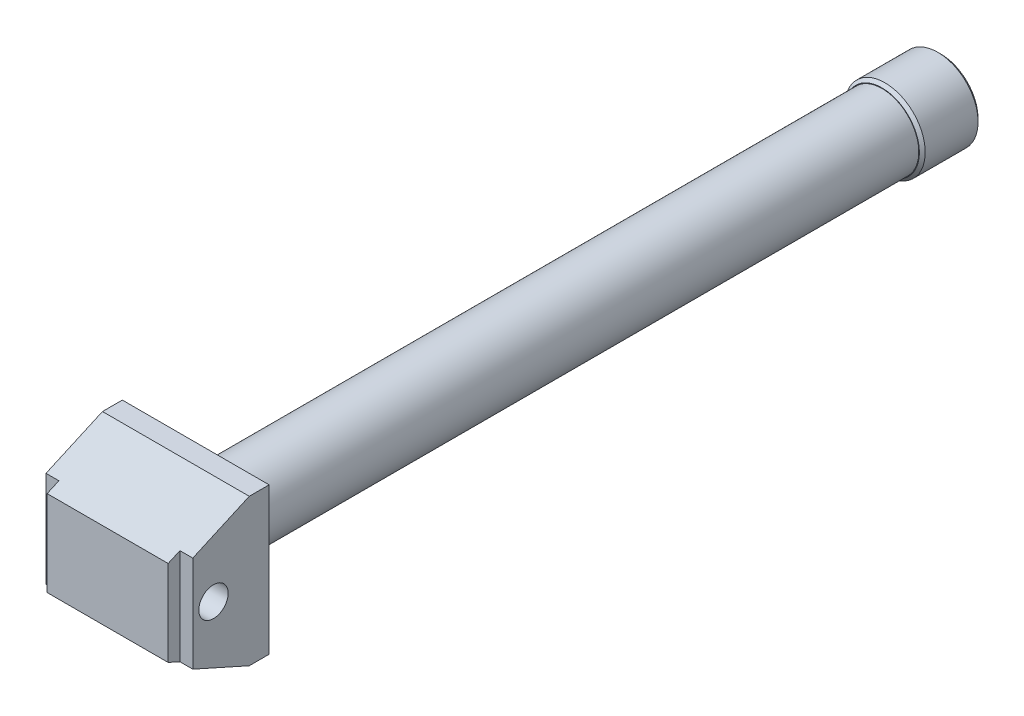
ISO-10303-21;
HEADER;
FILE_DESCRIPTION(('STEP AP214'),'2;1');
FILE_NAME('part.step','',(''),(''),'','','');
FILE_SCHEMA(('AUTOMOTIVE_DESIGN { 1 0 10303 214 1 1 1 1 }'));
ENDSEC;
DATA;
#1=APPLICATION_CONTEXT('core data for automotive mechanical design processes');
#2=APPLICATION_PROTOCOL_DEFINITION('international standard','automotive_design',2000,#1);
#3=PRODUCT_CONTEXT('',#1,'mechanical');
#4=PRODUCT('Part','Part','',(#3));
#5=PRODUCT_RELATED_PRODUCT_CATEGORY('part','',(#4));
#6=PRODUCT_DEFINITION_FORMATION('','',#4);
#7=PRODUCT_DEFINITION_CONTEXT('part definition',#1,'design');
#8=PRODUCT_DEFINITION('design','',#6,#7);
#9=PRODUCT_DEFINITION_SHAPE('','',#8);
#10=(LENGTH_UNIT() NAMED_UNIT(*) SI_UNIT(.MILLI.,.METRE.));
#11=(NAMED_UNIT(*) PLANE_ANGLE_UNIT() SI_UNIT($,.RADIAN.));
#12=(NAMED_UNIT(*) SI_UNIT($,.STERADIAN.) SOLID_ANGLE_UNIT());
#13=UNCERTAINTY_MEASURE_WITH_UNIT(LENGTH_MEASURE(1.E-05),#10,'distance_accuracy_value','');
#14=(GEOMETRIC_REPRESENTATION_CONTEXT(3) GLOBAL_UNCERTAINTY_ASSIGNED_CONTEXT((#13)) GLOBAL_UNIT_ASSIGNED_CONTEXT((#10,
#11,#12)) REPRESENTATION_CONTEXT('',''));
#15=CARTESIAN_POINT('',(0.,0.,0.));
#16=DIRECTION('',(0.,0.,1.));
#17=DIRECTION('',(1.,0.,0.));
#18=AXIS2_PLACEMENT_3D('',#15,#16,#17);
#19=CARTESIAN_POINT('',(0.,0.,-1169.));
#20=DIRECTION('',(0.,0.,-1.));
#21=DIRECTION('',(-1.,0.,0.));
#22=AXIS2_PLACEMENT_3D('',#19,#20,#21);
#23=CYLINDRICAL_SURFACE('',#22,68.445);
#24=CARTESIAN_POINT('',(0.,0.,-1264.));
#25=DIRECTION('',(0.,0.,-1.));
#26=DIRECTION('',(-1.,0.,0.));
#27=AXIS2_PLACEMENT_3D('',#24,#25,#26);
#28=CIRCLE('',#27,68.445);
#29=CARTESIAN_POINT('',(-68.445,0.,-1264.));
#30=VERTEX_POINT('',#29);
#31=EDGE_CURVE('E70',#30,#30,#28,.F.);
#32=ORIENTED_EDGE('',*,*,#31,.T.);
#33=EDGE_LOOP('',(#32));
#34=FACE_BOUND('',#33,.T.);
#35=CARTESIAN_POINT('',(0.,0.,-1174.));
#36=DIRECTION('',(0.,0.,-1.));
#37=DIRECTION('',(-1.,0.,0.));
#38=AXIS2_PLACEMENT_3D('',#35,#36,#37);
#39=CIRCLE('',#38,68.445);
#40=CARTESIAN_POINT('',(-68.445,0.,-1174.));
#41=VERTEX_POINT('',#40);
#42=EDGE_CURVE('E74',#41,#41,#39,.T.);
#43=ORIENTED_EDGE('',*,*,#42,.T.);
#44=EDGE_LOOP('',(#43));
#45=FACE_BOUND('',#44,.T.);
#46=ADVANCED_FACE('F62',(#34,#45),#23,.T.);
#47=CARTESIAN_POINT('',(0.,0.,-1169.));
#48=DIRECTION('',(0.,0.,-1.));
#49=DIRECTION('',(-1.,0.,0.));
#50=AXIS2_PLACEMENT_3D('',#47,#48,#49);
#51=PLANE('',#50);
#52=CARTESIAN_POINT('',(0.,0.,-1169.));
#53=DIRECTION('',(0.,0.,-1.));
#54=DIRECTION('',(-1.,0.,0.));
#55=AXIS2_PLACEMENT_3D('',#52,#53,#54);
#56=CIRCLE('',#55,63.445);
#57=CARTESIAN_POINT('',(-63.445,0.,-1169.));
#58=VERTEX_POINT('',#57);
#59=EDGE_CURVE('E12',#58,#58,#56,.F.);
#60=ORIENTED_EDGE('',*,*,#59,.T.);
#61=EDGE_LOOP('',(#60));
#62=FACE_BOUND('',#61,.T.);
#63=CARTESIAN_POINT('',(0.,0.,-1169.));
#64=DIRECTION('',(0.,0.,-1.));
#65=DIRECTION('',(-1.,0.,0.));
#66=AXIS2_PLACEMENT_3D('',#63,#64,#65);
#67=CIRCLE('',#66,62.5);
#68=CARTESIAN_POINT('',(-62.5,0.,-1169.));
#69=VERTEX_POINT('',#68);
#70=EDGE_CURVE('E83',#69,#69,#67,.T.);
#71=ORIENTED_EDGE('',*,*,#70,.T.);
#72=EDGE_LOOP('',(#71));
#73=FACE_BOUND('',#72,.T.);
#74=ADVANCED_FACE('F90',(#62,#73),#51,.F.);
#75=CARTESIAN_POINT('',(0.,0.,-1269.));
#76=DIRECTION('',(0.,0.,-1.));
#77=DIRECTION('',(-1.,0.,0.));
#78=AXIS2_PLACEMENT_3D('',#75,#76,#77);
#79=PLANE('',#78);
#80=CARTESIAN_POINT('',(0.,0.,-1269.));
#81=DIRECTION('',(0.,0.,-1.));
#82=DIRECTION('',(-1.,0.,0.));
#83=AXIS2_PLACEMENT_3D('',#80,#81,#82);
#84=CIRCLE('',#83,63.4450000000002);
#85=CARTESIAN_POINT('',(-63.4450000000002,0.,-1269.));
#86=VERTEX_POINT('',#85);
#87=EDGE_CURVE('E78',#86,#86,#84,.T.);
#88=ORIENTED_EDGE('',*,*,#87,.T.);
#89=EDGE_LOOP('',(#88));
#90=FACE_BOUND('',#89,.T.);
#91=CARTESIAN_POINT('',(0.,0.,-1269.));
#92=DIRECTION('',(0.,0.,-1.));
#93=DIRECTION('',(-1.,0.,0.));
#94=AXIS2_PLACEMENT_3D('',#91,#92,#93);
#95=CIRCLE('',#94,62.5);
#96=CARTESIAN_POINT('',(-62.5,0.,-1269.));
#97=VERTEX_POINT('',#96);
#98=EDGE_CURVE('E84',#97,#97,#95,.T.);
#99=ORIENTED_EDGE('',*,*,#98,.F.);
#100=EDGE_LOOP('',(#99));
#101=FACE_BOUND('',#100,.T.);
#102=ADVANCED_FACE('F96',(#90,#101),#79,.T.);
#103=CARTESIAN_POINT('',(0.,0.,-1169.));
#104=DIRECTION('',(0.,0.,-1.));
#105=DIRECTION('',(-1.,0.,0.));
#106=AXIS2_PLACEMENT_3D('',#103,#104,#105);
#107=CYLINDRICAL_SURFACE('',#106,62.5);
#108=ORIENTED_EDGE('',*,*,#70,.F.);
#109=EDGE_LOOP('',(#108));
#110=FACE_BOUND('',#109,.T.);
#111=ORIENTED_EDGE('',*,*,#98,.T.);
#112=EDGE_LOOP('',(#111));
#113=FACE_BOUND('',#112,.T.);
#114=ADVANCED_FACE('F92',(#110,#113),#107,.F.);
#115=CARTESIAN_POINT('',(0.,0.,-1269.));
#116=DIRECTION('',(0.,0.,1.));
#117=DIRECTION('',(1.,0.,0.));
#118=AXIS2_PLACEMENT_3D('',#115,#116,#117);
#119=CONICAL_SURFACE('',#118,63.4450000000002,0.785398163397461);
#120=ORIENTED_EDGE('',*,*,#31,.F.);
#121=EDGE_LOOP('',(#120));
#122=FACE_BOUND('',#121,.T.);
#123=ORIENTED_EDGE('',*,*,#87,.F.);
#124=EDGE_LOOP('',(#123));
#125=FACE_BOUND('',#124,.T.);
#126=ADVANCED_FACE('F95',(#122,#125),#119,.T.);
#127=CARTESIAN_POINT('',(0.,0.,-1174.));
#128=DIRECTION('',(0.,0.,-1.));
#129=DIRECTION('',(-1.,0.,0.));
#130=AXIS2_PLACEMENT_3D('',#127,#128,#129);
#131=CONICAL_SURFACE('',#130,68.445,0.785398163397432);
#132=ORIENTED_EDGE('',*,*,#59,.F.);
#133=EDGE_LOOP('',(#132));
#134=FACE_BOUND('',#133,.T.);
#135=ORIENTED_EDGE('',*,*,#42,.F.);
#136=EDGE_LOOP('',(#135));
#137=FACE_BOUND('',#136,.T.);
#138=ADVANCED_FACE('F65',(#134,#137),#131,.T.);
#139=CLOSED_SHELL('',(#46,#74,#102,#114,#126,#138));
#140=MANIFOLD_SOLID_BREP('B2',#139);
#141=CARTESIAN_POINT('',(-125.,125.,150.));
#142=DIRECTION('',(1.,0.,0.));
#143=DIRECTION('',(0.,1.,0.));
#144=AXIS2_PLACEMENT_3D('',#141,#142,#143);
#145=PLANE('',#144);
#146=CARTESIAN_POINT('',(-125.,0.,94.75));
#147=DIRECTION('',(-1.,0.,0.));
#148=DIRECTION('',(0.,-1.,0.));
#149=AXIS2_PLACEMENT_3D('',#146,#147,#148);
#150=CIRCLE('',#149,25.);
#151=CARTESIAN_POINT('',(-125.,-25.,94.75));
#152=VERTEX_POINT('',#151);
#153=EDGE_CURVE('E322',#152,#152,#150,.T.);
#154=ORIENTED_EDGE('',*,*,#153,.F.);
#155=EDGE_LOOP('',(#154));
#156=FACE_BOUND('',#155,.T.);
#157=DIRECTION('',(0.,-1.,0.));
#158=VECTOR('',#157,1.);
#159=CARTESIAN_POINT('',(-125.,125.,130.));
#160=LINE('',#159,#158);
#161=CARTESIAN_POINT('',(-125.,81.9516267860216,130.));
#162=VERTEX_POINT('',#161);
#163=CARTESIAN_POINT('',(-125.,-81.9516267860217,130.));
#164=VERTEX_POINT('',#163);
#165=EDGE_CURVE('E458',#162,#164,#160,.T.);
#166=ORIENTED_EDGE('',*,*,#165,.F.);
#167=DIRECTION('',(0.,-0.408527985139036,0.912745794489484));
#168=VECTOR('',#167,1.);
#169=CARTESIAN_POINT('',(-125.,125.,33.82));
#170=LINE('',#169,#168);
#171=CARTESIAN_POINT('',(-125.,125.,33.82));
#172=VERTEX_POINT('',#171);
#173=EDGE_CURVE('E310',#172,#162,#170,.T.);
#174=ORIENTED_EDGE('',*,*,#173,.F.);
#175=DIRECTION('',(0.,0.,-1.));
#176=VECTOR('',#175,1.);
#177=CARTESIAN_POINT('',(-125.,125.,150.));
#178=LINE('',#177,#176);
#179=CARTESIAN_POINT('',(-125.,125.,0.));
#180=VERTEX_POINT('',#179);
#181=EDGE_CURVE('E351',#172,#180,#178,.T.);
#182=ORIENTED_EDGE('',*,*,#181,.T.);
#183=DIRECTION('',(0.,-1.,0.));
#184=VECTOR('',#183,1.);
#185=CARTESIAN_POINT('',(-125.,125.,0.));
#186=LINE('',#185,#184);
#187=CARTESIAN_POINT('',(-125.,-125.,0.));
#188=VERTEX_POINT('',#187);
#189=EDGE_CURVE('E330',#180,#188,#186,.T.);
#190=ORIENTED_EDGE('',*,*,#189,.T.);
#191=DIRECTION('',(0.,0.,-1.));
#192=VECTOR('',#191,1.);
#193=CARTESIAN_POINT('',(-125.,-125.,150.));
#194=LINE('',#193,#192);
#195=CARTESIAN_POINT('',(-125.,-125.,33.82));
#196=VERTEX_POINT('',#195);
#197=EDGE_CURVE('E335',#196,#188,#194,.T.);
#198=ORIENTED_EDGE('',*,*,#197,.F.);
#199=DIRECTION('',(0.,-0.408527985139036,-0.912745794489484));
#200=VECTOR('',#199,1.);
#201=CARTESIAN_POINT('',(-125.,-125.,33.82));
#202=LINE('',#201,#200);
#203=EDGE_CURVE('E326',#164,#196,#202,.T.);
#204=ORIENTED_EDGE('',*,*,#203,.F.);
#205=EDGE_LOOP('',(#166,#174,#182,#190,#198,#204));
#206=FACE_BOUND('',#205,.T.);
#207=ADVANCED_FACE('F190',(#156,#206),#145,.F.);
#208=CARTESIAN_POINT('',(125.,-125.,150.));
#209=DIRECTION('',(0.,1.,0.));
#210=DIRECTION('',(0.,0.,1.));
#211=AXIS2_PLACEMENT_3D('',#208,#209,#210);
#212=PLANE('',#211);
#213=DIRECTION('',(0.,0.,-1.));
#214=VECTOR('',#213,1.);
#215=CARTESIAN_POINT('',(125.,-125.,150.));
#216=LINE('',#215,#214);
#217=CARTESIAN_POINT('',(125.,-125.,33.82));
#218=VERTEX_POINT('',#217);
#219=CARTESIAN_POINT('',(125.,-125.,0.));
#220=VERTEX_POINT('',#219);
#221=EDGE_CURVE('E357',#218,#220,#216,.T.);
#222=ORIENTED_EDGE('',*,*,#221,.F.);
#223=DIRECTION('',(-1.,0.,0.));
#224=VECTOR('',#223,1.);
#225=CARTESIAN_POINT('',(125.,-125.,33.82));
#226=LINE('',#225,#224);
#227=EDGE_CURVE('E466',#218,#196,#226,.T.);
#228=ORIENTED_EDGE('',*,*,#227,.T.);
#229=ORIENTED_EDGE('',*,*,#197,.T.);
#230=DIRECTION('',(1.,0.,0.));
#231=VECTOR('',#230,1.);
#232=CARTESIAN_POINT('',(125.,-125.,0.));
#233=LINE('',#232,#231);
#234=EDGE_CURVE('E339',#188,#220,#233,.T.);
#235=ORIENTED_EDGE('',*,*,#234,.T.);
#236=EDGE_LOOP('',(#222,#228,#229,#235));
#237=FACE_BOUND('',#236,.T.);
#238=ADVANCED_FACE('F385',(#237),#212,.F.);
#239=CARTESIAN_POINT('',(125.,125.,150.));
#240=DIRECTION('',(-1.,0.,0.));
#241=DIRECTION('',(0.,-1.,0.));
#242=AXIS2_PLACEMENT_3D('',#239,#240,#241);
#243=PLANE('',#242);
#244=CARTESIAN_POINT('',(125.,0.,94.75));
#245=DIRECTION('',(-1.,0.,0.));
#246=DIRECTION('',(0.,-1.,0.));
#247=AXIS2_PLACEMENT_3D('',#244,#245,#246);
#248=CIRCLE('',#247,25.);
#249=CARTESIAN_POINT('',(125.,-25.,94.75));
#250=VERTEX_POINT('',#249);
#251=EDGE_CURVE('E317',#250,#250,#248,.T.);
#252=ORIENTED_EDGE('',*,*,#251,.T.);
#253=EDGE_LOOP('',(#252));
#254=FACE_BOUND('',#253,.T.);
#255=DIRECTION('',(0.,-0.408527985139036,0.912745794489484));
#256=VECTOR('',#255,1.);
#257=CARTESIAN_POINT('',(125.,125.,33.82));
#258=LINE('',#257,#256);
#259=CARTESIAN_POINT('',(125.,125.,33.82));
#260=VERTEX_POINT('',#259);
#261=CARTESIAN_POINT('',(125.,81.9516267860217,130.));
#262=VERTEX_POINT('',#261);
#263=EDGE_CURVE('E303',#260,#262,#258,.T.);
#264=ORIENTED_EDGE('',*,*,#263,.T.);
#265=DIRECTION('',(0.,-1.,0.));
#266=VECTOR('',#265,1.);
#267=CARTESIAN_POINT('',(125.,125.,130.));
#268=LINE('',#267,#266);
#269=CARTESIAN_POINT('',(125.,-81.9516267860217,130.));
#270=VERTEX_POINT('',#269);
#271=EDGE_CURVE('E215',#262,#270,#268,.T.);
#272=ORIENTED_EDGE('',*,*,#271,.T.);
#273=DIRECTION('',(0.,-0.408527985139036,-0.912745794489484));
#274=VECTOR('',#273,1.);
#275=CARTESIAN_POINT('',(125.,-125.,33.82));
#276=LINE('',#275,#274);
#277=EDGE_CURVE('E470',#270,#218,#276,.T.);
#278=ORIENTED_EDGE('',*,*,#277,.T.);
#279=ORIENTED_EDGE('',*,*,#221,.T.);
#280=DIRECTION('',(0.,1.,0.));
#281=VECTOR('',#280,1.);
#282=CARTESIAN_POINT('',(125.,125.,0.));
#283=LINE('',#282,#281);
#284=CARTESIAN_POINT('',(125.,125.,0.));
#285=VERTEX_POINT('',#284);
#286=EDGE_CURVE('E343',#220,#285,#283,.T.);
#287=ORIENTED_EDGE('',*,*,#286,.T.);
#288=DIRECTION('',(0.,0.,-1.));
#289=VECTOR('',#288,1.);
#290=CARTESIAN_POINT('',(125.,125.,150.));
#291=LINE('',#290,#289);
#292=EDGE_CURVE('E354',#260,#285,#291,.T.);
#293=ORIENTED_EDGE('',*,*,#292,.F.);
#294=EDGE_LOOP('',(#264,#272,#278,#279,#287,#293));
#295=FACE_BOUND('',#294,.T.);
#296=ADVANCED_FACE('F392',(#254,#295),#243,.F.);
#297=CARTESIAN_POINT('',(125.,125.,150.));
#298=DIRECTION('',(0.,-1.,0.));
#299=DIRECTION('',(1.,0.,0.));
#300=AXIS2_PLACEMENT_3D('',#297,#298,#299);
#301=PLANE('',#300);
#302=ORIENTED_EDGE('',*,*,#181,.F.);
#303=DIRECTION('',(-1.,0.,0.));
#304=VECTOR('',#303,1.);
#305=CARTESIAN_POINT('',(125.,125.,33.82));
#306=LINE('',#305,#304);
#307=EDGE_CURVE('E298',#260,#172,#306,.T.);
#308=ORIENTED_EDGE('',*,*,#307,.F.);
#309=ORIENTED_EDGE('',*,*,#292,.T.);
#310=DIRECTION('',(-1.,0.,0.));
#311=VECTOR('',#310,1.);
#312=CARTESIAN_POINT('',(125.,125.,0.));
#313=LINE('',#312,#311);
#314=EDGE_CURVE('E347',#285,#180,#313,.T.);
#315=ORIENTED_EDGE('',*,*,#314,.T.);
#316=EDGE_LOOP('',(#302,#308,#309,#315));
#317=FACE_BOUND('',#316,.T.);
#318=ADVANCED_FACE('F399',(#317),#301,.F.);
#319=CARTESIAN_POINT('',(0.,0.,150.));
#320=DIRECTION('',(0.,0.,-1.));
#321=DIRECTION('',(-1.,0.,0.));
#322=AXIS2_PLACEMENT_3D('',#319,#320,#321);
#323=PLANE('',#322);
#324=DIRECTION('',(-1.,0.,0.));
#325=VECTOR('',#324,1.);
#326=CARTESIAN_POINT('',(125.,73.,150.));
#327=LINE('',#326,#325);
#328=CARTESIAN_POINT('',(103.06,73.,150.));
#329=VERTEX_POINT('',#328);
#330=CARTESIAN_POINT('',(-103.06,73.,150.));
#331=VERTEX_POINT('',#330);
#332=EDGE_CURVE('E287',#329,#331,#327,.T.);
#333=ORIENTED_EDGE('',*,*,#332,.T.);
#334=DIRECTION('',(0.,1.,0.));
#335=VECTOR('',#334,1.);
#336=CARTESIAN_POINT('',(-103.06,161.227505617983,150.));
#337=LINE('',#336,#335);
#338=CARTESIAN_POINT('',(-103.06,-73.,150.));
#339=VERTEX_POINT('',#338);
#340=EDGE_CURVE('E291',#339,#331,#337,.T.);
#341=ORIENTED_EDGE('',*,*,#340,.F.);
#342=DIRECTION('',(-1.,0.,0.));
#343=VECTOR('',#342,1.);
#344=CARTESIAN_POINT('',(125.,-73.,150.));
#345=LINE('',#344,#343);
#346=CARTESIAN_POINT('',(103.06,-73.,150.));
#347=VERTEX_POINT('',#346);
#348=EDGE_CURVE('E289',#347,#339,#345,.T.);
#349=ORIENTED_EDGE('',*,*,#348,.F.);
#350=DIRECTION('',(0.,-1.,0.));
#351=VECTOR('',#350,1.);
#352=CARTESIAN_POINT('',(103.06,161.227505617983,150.));
#353=LINE('',#352,#351);
#354=EDGE_CURVE('E272',#329,#347,#353,.T.);
#355=ORIENTED_EDGE('',*,*,#354,.F.);
#356=EDGE_LOOP('',(#333,#341,#349,#355));
#357=FACE_BOUND('',#356,.T.);
#358=ADVANCED_FACE('F285',(#357),#323,.F.);
#359=CARTESIAN_POINT('',(0.,0.,0.));
#360=DIRECTION('',(0.,0.,-1.));
#361=DIRECTION('',(-1.,0.,0.));
#362=AXIS2_PLACEMENT_3D('',#359,#360,#361);
#363=PLANE('',#362);
#364=CARTESIAN_POINT('',(0.,0.,0.));
#365=DIRECTION('',(0.,0.,-1.));
#366=DIRECTION('',(-1.,0.,0.));
#367=AXIS2_PLACEMENT_3D('',#364,#365,#366);
#368=CIRCLE('',#367,62.5);
#369=CARTESIAN_POINT('',(-62.5,0.,0.));
#370=VERTEX_POINT('',#369);
#371=EDGE_CURVE('E331',#370,#370,#368,.T.);
#372=ORIENTED_EDGE('',*,*,#371,.F.);
#373=EDGE_LOOP('',(#372));
#374=FACE_BOUND('',#373,.T.);
#375=ORIENTED_EDGE('',*,*,#189,.F.);
#376=ORIENTED_EDGE('',*,*,#314,.F.);
#377=ORIENTED_EDGE('',*,*,#286,.F.);
#378=ORIENTED_EDGE('',*,*,#234,.F.);
#379=EDGE_LOOP('',(#375,#376,#377,#378));
#380=FACE_BOUND('',#379,.T.);
#381=ADVANCED_FACE('F404',(#374,#380),#363,.T.);
#382=CARTESIAN_POINT('',(0.,0.,-1269.));
#383=DIRECTION('',(0.,0.,1.));
#384=DIRECTION('',(1.,0.,0.));
#385=AXIS2_PLACEMENT_3D('',#382,#383,#384);
#386=CYLINDRICAL_SURFACE('',#385,62.5);
#387=CARTESIAN_POINT('',(0.,0.,-1269.));
#388=DIRECTION('',(0.,0.,-1.));
#389=DIRECTION('',(-1.,0.,0.));
#390=AXIS2_PLACEMENT_3D('',#387,#388,#389);
#391=CIRCLE('',#390,62.5);
#392=CARTESIAN_POINT('',(-62.5,0.,-1269.));
#393=VERTEX_POINT('',#392);
#394=EDGE_CURVE('E321',#393,#393,#391,.T.);
#395=ORIENTED_EDGE('',*,*,#394,.F.);
#396=EDGE_LOOP('',(#395));
#397=FACE_BOUND('',#396,.T.);
#398=ORIENTED_EDGE('',*,*,#371,.T.);
#399=EDGE_LOOP('',(#398));
#400=FACE_BOUND('',#399,.T.);
#401=ADVANCED_FACE('F407',(#397,#400),#386,.T.);
#402=CARTESIAN_POINT('',(0.,0.,-1269.));
#403=DIRECTION('',(0.,0.,-1.));
#404=DIRECTION('',(-1.,0.,0.));
#405=AXIS2_PLACEMENT_3D('',#402,#403,#404);
#406=PLANE('',#405);
#407=CARTESIAN_POINT('',(0.,0.,-1269.));
#408=DIRECTION('',(0.,0.,-1.));
#409=DIRECTION('',(-1.,0.,0.));
#410=AXIS2_PLACEMENT_3D('',#407,#408,#409);
#411=CIRCLE('',#410,42.4999999999998);
#412=CARTESIAN_POINT('',(-42.4999999999998,0.,-1269.));
#413=VERTEX_POINT('',#412);
#414=EDGE_CURVE('E60',#413,#413,#411,.F.);
#415=ORIENTED_EDGE('',*,*,#414,.T.);
#416=EDGE_LOOP('',(#415));
#417=FACE_BOUND('',#416,.T.);
#418=ORIENTED_EDGE('',*,*,#394,.T.);
#419=EDGE_LOOP('',(#418));
#420=FACE_BOUND('',#419,.T.);
#421=ADVANCED_FACE('F413',(#417,#420),#406,.T.);
#422=CARTESIAN_POINT('',(125.,-125.,33.82));
#423=DIRECTION('',(0.,0.912745794489484,-0.408527985139036));
#424=DIRECTION('',(0.,0.408527985139036,0.912745794489484));
#425=AXIS2_PLACEMENT_3D('',#422,#423,#424);
#426=PLANE('',#425);
#427=ORIENTED_EDGE('',*,*,#348,.T.);
#428=DIRECTION('',(0.,-0.408527985139036,-0.912745794489484));
#429=VECTOR('',#428,1.);
#430=CARTESIAN_POINT('',(-103.06,-125.,33.82));
#431=LINE('',#430,#429);
#432=CARTESIAN_POINT('',(-103.06,-81.9516267860217,130.));
#433=VERTEX_POINT('',#432);
#434=EDGE_CURVE('E306',#339,#433,#431,.T.);
#435=ORIENTED_EDGE('',*,*,#434,.T.);
#436=DIRECTION('',(1.,0.,0.));
#437=VECTOR('',#436,1.);
#438=CARTESIAN_POINT('',(125.,-81.9516267860216,130.));
#439=LINE('',#438,#437);
#440=EDGE_CURVE('E461',#164,#433,#439,.T.);
#441=ORIENTED_EDGE('',*,*,#440,.F.);
#442=ORIENTED_EDGE('',*,*,#203,.T.);
#443=ORIENTED_EDGE('',*,*,#227,.F.);
#444=ORIENTED_EDGE('',*,*,#277,.F.);
#445=DIRECTION('',(-1.,0.,0.));
#446=VECTOR('',#445,1.);
#447=CARTESIAN_POINT('',(125.,-81.9516267860216,130.));
#448=LINE('',#447,#446);
#449=CARTESIAN_POINT('',(103.06,-81.9516267860216,130.));
#450=VERTEX_POINT('',#449);
#451=EDGE_CURVE('E451',#270,#450,#448,.T.);
#452=ORIENTED_EDGE('',*,*,#451,.T.);
#453=DIRECTION('',(0.,0.408527985139036,0.912745794489484));
#454=VECTOR('',#453,1.);
#455=CARTESIAN_POINT('',(103.06,-125.,33.82));
#456=LINE('',#455,#454);
#457=EDGE_CURVE('E455',#450,#347,#456,.T.);
#458=ORIENTED_EDGE('',*,*,#457,.T.);
#459=EDGE_LOOP('',(#427,#435,#441,#442,#443,#444,#452,#458));
#460=FACE_BOUND('',#459,.T.);
#461=ADVANCED_FACE('F416',(#460),#426,.F.);
#462=CARTESIAN_POINT('',(125.,125.,33.82));
#463=DIRECTION('',(0.,-0.912745794489484,-0.408527985139036));
#464=DIRECTION('',(0.,0.408527985139036,-0.912745794489484));
#465=AXIS2_PLACEMENT_3D('',#462,#463,#464);
#466=PLANE('',#465);
#467=DIRECTION('',(-1.,0.,0.));
#468=VECTOR('',#467,1.);
#469=CARTESIAN_POINT('',(125.,81.9516267860217,130.));
#470=LINE('',#469,#468);
#471=CARTESIAN_POINT('',(-103.06,81.9516267860216,130.));
#472=VERTEX_POINT('',#471);
#473=EDGE_CURVE('E279',#472,#162,#470,.T.);
#474=ORIENTED_EDGE('',*,*,#473,.F.);
#475=DIRECTION('',(0.,-0.408527985139036,0.912745794489484));
#476=VECTOR('',#475,1.);
#477=CARTESIAN_POINT('',(-103.06,125.,33.82));
#478=LINE('',#477,#476);
#479=EDGE_CURVE('E296',#472,#331,#478,.T.);
#480=ORIENTED_EDGE('',*,*,#479,.T.);
#481=ORIENTED_EDGE('',*,*,#332,.F.);
#482=DIRECTION('',(0.,0.408527985139036,-0.912745794489484));
#483=VECTOR('',#482,1.);
#484=CARTESIAN_POINT('',(103.06,125.,33.82));
#485=LINE('',#484,#483);
#486=CARTESIAN_POINT('',(103.06,81.9516267860217,130.));
#487=VERTEX_POINT('',#486);
#488=EDGE_CURVE('E269',#329,#487,#485,.T.);
#489=ORIENTED_EDGE('',*,*,#488,.T.);
#490=DIRECTION('',(1.,0.,0.));
#491=VECTOR('',#490,1.);
#492=CARTESIAN_POINT('',(125.,81.9516267860217,130.));
#493=LINE('',#492,#491);
#494=EDGE_CURVE('E280',#487,#262,#493,.T.);
#495=ORIENTED_EDGE('',*,*,#494,.T.);
#496=ORIENTED_EDGE('',*,*,#263,.F.);
#497=ORIENTED_EDGE('',*,*,#307,.T.);
#498=ORIENTED_EDGE('',*,*,#173,.T.);
#499=EDGE_LOOP('',(#474,#480,#481,#489,#495,#496,#497,#498));
#500=FACE_BOUND('',#499,.T.);
#501=ADVANCED_FACE('F295',(#500),#466,.F.);
#502=CARTESIAN_POINT('',(125.,0.,94.75));
#503=DIRECTION('',(-1.,0.,0.));
#504=DIRECTION('',(0.,-1.,0.));
#505=AXIS2_PLACEMENT_3D('',#502,#503,#504);
#506=CYLINDRICAL_SURFACE('',#505,25.);
#507=ORIENTED_EDGE('',*,*,#251,.F.);
#508=EDGE_LOOP('',(#507));
#509=FACE_BOUND('',#508,.T.);
#510=ORIENTED_EDGE('',*,*,#153,.T.);
#511=EDGE_LOOP('',(#510));
#512=FACE_BOUND('',#511,.T.);
#513=ADVANCED_FACE('F418',(#509,#512),#506,.F.);
#514=CARTESIAN_POINT('',(0.,0.,106.066017177982));
#515=DIRECTION('',(0.,0.,-1.));
#516=DIRECTION('',(-1.,0.,0.));
#517=AXIS2_PLACEMENT_3D('',#514,#515,#516);
#518=CYLINDRICAL_SURFACE('',#517,37.5);
#519=CARTESIAN_POINT('',(0.,0.,-1264.));
#520=DIRECTION('',(0.,0.,-1.));
#521=DIRECTION('',(-1.,0.,0.));
#522=AXIS2_PLACEMENT_3D('',#519,#520,#521);
#523=CIRCLE('',#522,37.5);
#524=CARTESIAN_POINT('',(-37.5,0.,-1264.));
#525=VERTEX_POINT('',#524);
#526=EDGE_CURVE('E200',#525,#525,#523,.T.);
#527=ORIENTED_EDGE('',*,*,#526,.T.);
#528=EDGE_LOOP('',(#527));
#529=FACE_BOUND('',#528,.T.);
#530=CARTESIAN_POINT('',(0.,0.,0.));
#531=DIRECTION('',(0.,0.,-1.));
#532=DIRECTION('',(-1.,0.,0.));
#533=AXIS2_PLACEMENT_3D('',#530,#531,#532);
#534=CIRCLE('',#533,37.5);
#535=CARTESIAN_POINT('',(-37.5,0.,0.));
#536=VERTEX_POINT('',#535);
#537=EDGE_CURVE('E299',#536,#536,#534,.F.);
#538=ORIENTED_EDGE('',*,*,#537,.T.);
#539=EDGE_LOOP('',(#538));
#540=FACE_BOUND('',#539,.T.);
#541=ADVANCED_FACE('F371',(#529,#540),#518,.F.);
#542=CARTESIAN_POINT('',(0.,0.,0.));
#543=DIRECTION('',(0.,0.,-1.));
#544=DIRECTION('',(-1.,0.,0.));
#545=AXIS2_PLACEMENT_3D('',#542,#543,#544);
#546=PLANE('',#545);
#547=ORIENTED_EDGE('',*,*,#537,.F.);
#548=EDGE_LOOP('',(#547));
#549=FACE_BOUND('',#548,.T.);
#550=ADVANCED_FACE('F429',(#549),#546,.T.);
#551=CARTESIAN_POINT('',(103.06,161.227505617983,130.));
#552=DIRECTION('',(-1.,0.,0.));
#553=DIRECTION('',(0.,0.,1.));
#554=AXIS2_PLACEMENT_3D('',#551,#552,#553);
#555=PLANE('',#554);
#556=DIRECTION('',(0.,-1.,0.));
#557=VECTOR('',#556,1.);
#558=CARTESIAN_POINT('',(103.06,161.227505617983,130.));
#559=LINE('',#558,#557);
#560=EDGE_CURVE('E275',#487,#450,#559,.T.);
#561=ORIENTED_EDGE('',*,*,#560,.F.);
#562=ORIENTED_EDGE('',*,*,#488,.F.);
#563=ORIENTED_EDGE('',*,*,#354,.T.);
#564=ORIENTED_EDGE('',*,*,#457,.F.);
#565=EDGE_LOOP('',(#561,#562,#563,#564));
#566=FACE_BOUND('',#565,.T.);
#567=ADVANCED_FACE('F271',(#566),#555,.F.);
#568=CARTESIAN_POINT('',(0.,0.,130.));
#569=DIRECTION('',(0.,0.,-1.));
#570=DIRECTION('',(-1.,0.,0.));
#571=AXIS2_PLACEMENT_3D('',#568,#569,#570);
#572=PLANE('',#571);
#573=ORIENTED_EDGE('',*,*,#271,.F.);
#574=ORIENTED_EDGE('',*,*,#494,.F.);
#575=ORIENTED_EDGE('',*,*,#560,.T.);
#576=ORIENTED_EDGE('',*,*,#451,.F.);
#577=EDGE_LOOP('',(#573,#574,#575,#576));
#578=FACE_BOUND('',#577,.T.);
#579=ADVANCED_FACE('F432',(#578),#572,.F.);
#580=CARTESIAN_POINT('',(-103.06,161.227505617983,130.));
#581=DIRECTION('',(1.,0.,0.));
#582=DIRECTION('',(0.,1.,0.));
#583=AXIS2_PLACEMENT_3D('',#580,#581,#582);
#584=PLANE('',#583);
#585=ORIENTED_EDGE('',*,*,#340,.T.);
#586=ORIENTED_EDGE('',*,*,#479,.F.);
#587=DIRECTION('',(0.,1.,0.));
#588=VECTOR('',#587,1.);
#589=CARTESIAN_POINT('',(-103.06,161.227505617983,130.));
#590=LINE('',#589,#588);
#591=EDGE_CURVE('E207',#433,#472,#590,.T.);
#592=ORIENTED_EDGE('',*,*,#591,.F.);
#593=ORIENTED_EDGE('',*,*,#434,.F.);
#594=EDGE_LOOP('',(#585,#586,#592,#593));
#595=FACE_BOUND('',#594,.T.);
#596=ADVANCED_FACE('F381',(#595),#584,.F.);
#597=CARTESIAN_POINT('',(0.,0.,130.));
#598=DIRECTION('',(0.,0.,1.));
#599=DIRECTION('',(1.,0.,0.));
#600=AXIS2_PLACEMENT_3D('',#597,#598,#599);
#601=PLANE('',#600);
#602=ORIENTED_EDGE('',*,*,#440,.T.);
#603=ORIENTED_EDGE('',*,*,#591,.T.);
#604=ORIENTED_EDGE('',*,*,#473,.T.);
#605=ORIENTED_EDGE('',*,*,#165,.T.);
#606=EDGE_LOOP('',(#602,#603,#604,#605));
#607=FACE_BOUND('',#606,.T.);
#608=ADVANCED_FACE('F375',(#607),#601,.T.);
#609=CARTESIAN_POINT('',(0.,0.,-1264.));
#610=DIRECTION('',(0.,0.,-1.));
#611=DIRECTION('',(-1.,0.,0.));
#612=AXIS2_PLACEMENT_3D('',#609,#610,#611);
#613=CONICAL_SURFACE('',#612,37.5,0.785398163397434);
#614=ORIENTED_EDGE('',*,*,#414,.F.);
#615=EDGE_LOOP('',(#614));
#616=FACE_BOUND('',#615,.T.);
#617=ORIENTED_EDGE('',*,*,#526,.F.);
#618=EDGE_LOOP('',(#617));
#619=FACE_BOUND('',#618,.T.);
#620=ADVANCED_FACE('F193',(#616,#619),#613,.F.);
#621=CLOSED_SHELL('',(#207,#238,#296,#318,#358,#381,#401,#421,#461,#501,#513,#541,#550,#567,
#579,#596,#608,#620));
#622=MANIFOLD_SOLID_BREP('B7',#621);
#623=ADVANCED_BREP_SHAPE_REPRESENTATION('',(#18,#140,#622),#14);
#624=SHAPE_DEFINITION_REPRESENTATION(#9,#623);
ENDSEC;
END-ISO-10303-21;
